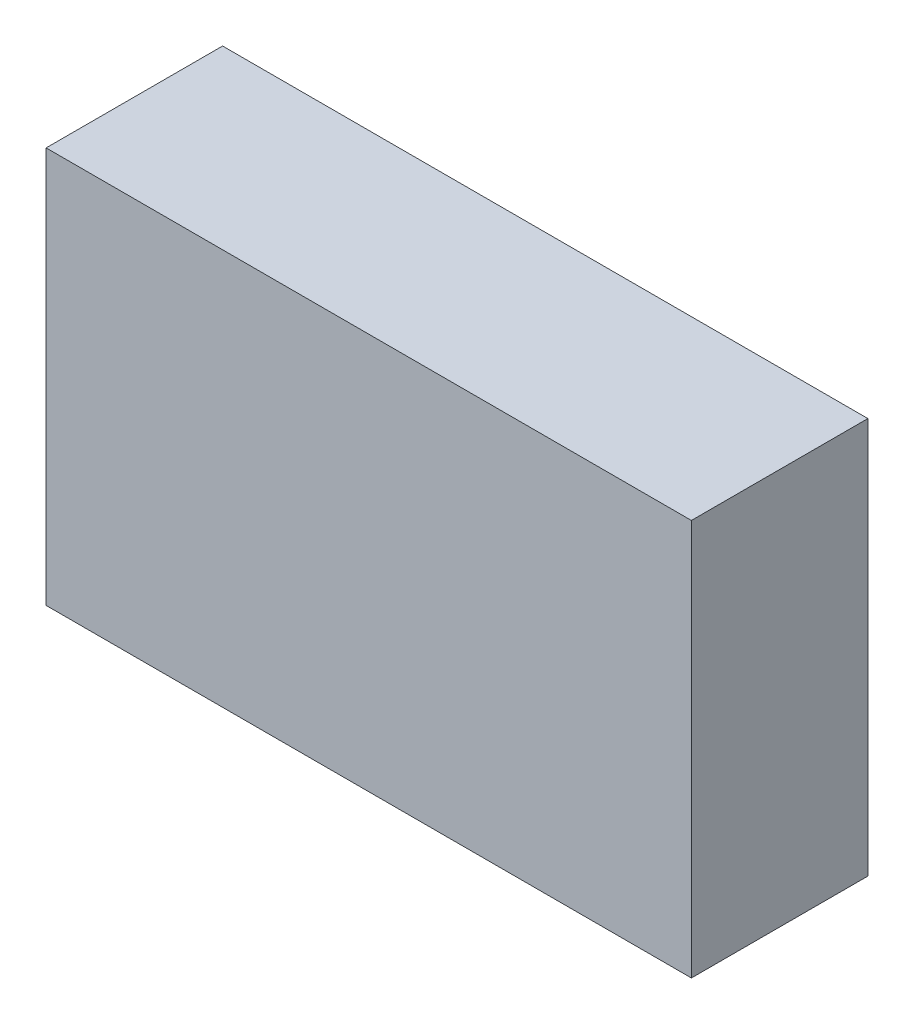
ISO-10303-21;
HEADER;
FILE_DESCRIPTION(('STEP AP214'),'2;1');
FILE_NAME('part.step','',(''),(''),'','','');
FILE_SCHEMA(('AUTOMOTIVE_DESIGN { 1 0 10303 214 1 1 1 1 }'));
ENDSEC;
DATA;
#1=APPLICATION_CONTEXT('core data for automotive mechanical design processes');
#2=APPLICATION_PROTOCOL_DEFINITION('international standard','automotive_design',2000,#1);
#3=PRODUCT_CONTEXT('',#1,'mechanical');
#4=PRODUCT('Part','Part','',(#3));
#5=PRODUCT_RELATED_PRODUCT_CATEGORY('part','',(#4));
#6=PRODUCT_DEFINITION_FORMATION('','',#4);
#7=PRODUCT_DEFINITION_CONTEXT('part definition',#1,'design');
#8=PRODUCT_DEFINITION('design','',#6,#7);
#9=PRODUCT_DEFINITION_SHAPE('','',#8);
#10=(LENGTH_UNIT() NAMED_UNIT(*) SI_UNIT(.MILLI.,.METRE.));
#11=(NAMED_UNIT(*) PLANE_ANGLE_UNIT() SI_UNIT($,.RADIAN.));
#12=(NAMED_UNIT(*) SI_UNIT($,.STERADIAN.) SOLID_ANGLE_UNIT());
#13=UNCERTAINTY_MEASURE_WITH_UNIT(LENGTH_MEASURE(1.E-05),#10,'distance_accuracy_value','');
#14=(GEOMETRIC_REPRESENTATION_CONTEXT(3) GLOBAL_UNCERTAINTY_ASSIGNED_CONTEXT((#13)) GLOBAL_UNIT_ASSIGNED_CONTEXT((#10,
#11,#12)) REPRESENTATION_CONTEXT('',''));
#15=CARTESIAN_POINT('',(0.,0.,0.));
#16=DIRECTION('',(0.,0.,1.));
#17=DIRECTION('',(1.,0.,0.));
#18=AXIS2_PLACEMENT_3D('',#15,#16,#17);
#19=CARTESIAN_POINT('',(-14.9,-9.15,8.15));
#20=DIRECTION('',(0.,0.,1.));
#21=DIRECTION('',(1.,0.,0.));
#22=AXIS2_PLACEMENT_3D('',#19,#20,#21);
#23=PLANE('',#22);
#24=DIRECTION('',(0.,1.,0.));
#25=VECTOR('',#24,1.);
#26=CARTESIAN_POINT('',(-14.9,-9.15,8.15));
#27=LINE('',#26,#25);
#28=CARTESIAN_POINT('',(-14.9,-9.15,8.15));
#29=VERTEX_POINT('',#28);
#30=CARTESIAN_POINT('',(-14.9,9.15,8.15));
#31=VERTEX_POINT('',#30);
#32=EDGE_CURVE('E88',#29,#31,#27,.T.);
#33=ORIENTED_EDGE('',*,*,#32,.F.);
#34=DIRECTION('',(1.,0.,0.));
#35=VECTOR('',#34,1.);
#36=CARTESIAN_POINT('',(-14.9,-9.15,8.15));
#37=LINE('',#36,#35);
#38=CARTESIAN_POINT('',(14.9,-9.15,8.15));
#39=VERTEX_POINT('',#38);
#40=EDGE_CURVE('E70',#29,#39,#37,.T.);
#41=ORIENTED_EDGE('',*,*,#40,.T.);
#42=DIRECTION('',(0.,1.,0.));
#43=VECTOR('',#42,1.);
#44=CARTESIAN_POINT('',(14.9,-9.15,8.15));
#45=LINE('',#44,#43);
#46=CARTESIAN_POINT('',(14.9,9.15,8.15));
#47=VERTEX_POINT('',#46);
#48=EDGE_CURVE('E82',#39,#47,#45,.T.);
#49=ORIENTED_EDGE('',*,*,#48,.T.);
#50=DIRECTION('',(1.,0.,0.));
#51=VECTOR('',#50,1.);
#52=CARTESIAN_POINT('',(-14.9,9.15,8.15));
#53=LINE('',#52,#51);
#54=EDGE_CURVE('E10',#31,#47,#53,.T.);
#55=ORIENTED_EDGE('',*,*,#54,.F.);
#56=EDGE_LOOP('',(#33,#41,#49,#55));
#57=FACE_BOUND('',#56,.T.);
#58=ADVANCED_FACE('F16',(#57),#23,.T.);
#59=CARTESIAN_POINT('',(-14.9,-9.15,0.));
#60=DIRECTION('',(0.,0.,1.));
#61=DIRECTION('',(1.,0.,0.));
#62=AXIS2_PLACEMENT_3D('',#59,#60,#61);
#63=PLANE('',#62);
#64=DIRECTION('',(1.,0.,0.));
#65=VECTOR('',#64,1.);
#66=CARTESIAN_POINT('',(-14.9,9.15,0.));
#67=LINE('',#66,#65);
#68=CARTESIAN_POINT('',(-14.9,9.15,0.));
#69=VERTEX_POINT('',#68);
#70=CARTESIAN_POINT('',(14.9,9.15,0.));
#71=VERTEX_POINT('',#70);
#72=EDGE_CURVE('E19',#69,#71,#67,.T.);
#73=ORIENTED_EDGE('',*,*,#72,.T.);
#74=DIRECTION('',(0.,1.,0.));
#75=VECTOR('',#74,1.);
#76=CARTESIAN_POINT('',(14.9,-9.15,0.));
#77=LINE('',#76,#75);
#78=CARTESIAN_POINT('',(14.9,-9.15,0.));
#79=VERTEX_POINT('',#78);
#80=EDGE_CURVE('E103',#79,#71,#77,.T.);
#81=ORIENTED_EDGE('',*,*,#80,.F.);
#82=DIRECTION('',(1.,0.,0.));
#83=VECTOR('',#82,1.);
#84=CARTESIAN_POINT('',(-14.9,-9.15,0.));
#85=LINE('',#84,#83);
#86=CARTESIAN_POINT('',(-14.9,-9.15,0.));
#87=VERTEX_POINT('',#86);
#88=EDGE_CURVE('E81',#87,#79,#85,.T.);
#89=ORIENTED_EDGE('',*,*,#88,.F.);
#90=DIRECTION('',(0.,1.,0.));
#91=VECTOR('',#90,1.);
#92=CARTESIAN_POINT('',(-14.9,-9.15,0.));
#93=LINE('',#92,#91);
#94=EDGE_CURVE('E89',#87,#69,#93,.T.);
#95=ORIENTED_EDGE('',*,*,#94,.T.);
#96=EDGE_LOOP('',(#73,#81,#89,#95));
#97=FACE_BOUND('',#96,.T.);
#98=ADVANCED_FACE('F124',(#97),#63,.F.);
#99=CARTESIAN_POINT('',(-14.9,9.15,0.));
#100=DIRECTION('',(0.,1.,0.));
#101=DIRECTION('',(1.,0.,0.));
#102=AXIS2_PLACEMENT_3D('',#99,#100,#101);
#103=PLANE('',#102);
#104=ORIENTED_EDGE('',*,*,#72,.F.);
#105=DIRECTION('',(0.,0.,1.));
#106=VECTOR('',#105,1.);
#107=CARTESIAN_POINT('',(-14.9,9.15,0.));
#108=LINE('',#107,#106);
#109=EDGE_CURVE('E93',#69,#31,#108,.T.);
#110=ORIENTED_EDGE('',*,*,#109,.T.);
#111=ORIENTED_EDGE('',*,*,#54,.T.);
#112=DIRECTION('',(0.,0.,1.));
#113=VECTOR('',#112,1.);
#114=CARTESIAN_POINT('',(14.9,9.15,0.));
#115=LINE('',#114,#113);
#116=EDGE_CURVE('E99',#71,#47,#115,.T.);
#117=ORIENTED_EDGE('',*,*,#116,.F.);
#118=EDGE_LOOP('',(#104,#110,#111,#117));
#119=FACE_BOUND('',#118,.T.);
#120=ADVANCED_FACE('F119',(#119),#103,.T.);
#121=CARTESIAN_POINT('',(-14.9,-9.15,0.));
#122=DIRECTION('',(0.,1.,0.));
#123=DIRECTION('',(1.,0.,0.));
#124=AXIS2_PLACEMENT_3D('',#121,#122,#123);
#125=PLANE('',#124);
#126=DIRECTION('',(0.,0.,1.));
#127=VECTOR('',#126,1.);
#128=CARTESIAN_POINT('',(14.9,-9.15,0.));
#129=LINE('',#128,#127);
#130=EDGE_CURVE('E76',#79,#39,#129,.T.);
#131=ORIENTED_EDGE('',*,*,#130,.T.);
#132=ORIENTED_EDGE('',*,*,#40,.F.);
#133=DIRECTION('',(0.,0.,1.));
#134=VECTOR('',#133,1.);
#135=CARTESIAN_POINT('',(-14.9,-9.15,0.));
#136=LINE('',#135,#134);
#137=EDGE_CURVE('E73',#87,#29,#136,.T.);
#138=ORIENTED_EDGE('',*,*,#137,.F.);
#139=ORIENTED_EDGE('',*,*,#88,.T.);
#140=EDGE_LOOP('',(#131,#132,#138,#139));
#141=FACE_BOUND('',#140,.T.);
#142=ADVANCED_FACE('F72',(#141),#125,.F.);
#143=CARTESIAN_POINT('',(14.9,-9.15,0.));
#144=DIRECTION('',(1.,0.,0.));
#145=DIRECTION('',(0.,1.,0.));
#146=AXIS2_PLACEMENT_3D('',#143,#144,#145);
#147=PLANE('',#146);
#148=ORIENTED_EDGE('',*,*,#130,.F.);
#149=ORIENTED_EDGE('',*,*,#80,.T.);
#150=ORIENTED_EDGE('',*,*,#116,.T.);
#151=ORIENTED_EDGE('',*,*,#48,.F.);
#152=EDGE_LOOP('',(#148,#149,#150,#151));
#153=FACE_BOUND('',#152,.T.);
#154=ADVANCED_FACE('F132',(#153),#147,.T.);
#155=CARTESIAN_POINT('',(-14.9,-9.15,0.));
#156=DIRECTION('',(1.,0.,0.));
#157=DIRECTION('',(0.,1.,0.));
#158=AXIS2_PLACEMENT_3D('',#155,#156,#157);
#159=PLANE('',#158);
#160=ORIENTED_EDGE('',*,*,#32,.T.);
#161=ORIENTED_EDGE('',*,*,#109,.F.);
#162=ORIENTED_EDGE('',*,*,#94,.F.);
#163=ORIENTED_EDGE('',*,*,#137,.T.);
#164=EDGE_LOOP('',(#160,#161,#162,#163));
#165=FACE_BOUND('',#164,.T.);
#166=ADVANCED_FACE('F86',(#165),#159,.F.);
#167=CLOSED_SHELL('',(#58,#98,#120,#142,#154,#166));
#168=MANIFOLD_SOLID_BREP('B1',#167);
#169=ADVANCED_BREP_SHAPE_REPRESENTATION('',(#18,#168),#14);
#170=SHAPE_DEFINITION_REPRESENTATION(#9,#169);
ENDSEC;
END-ISO-10303-21;
